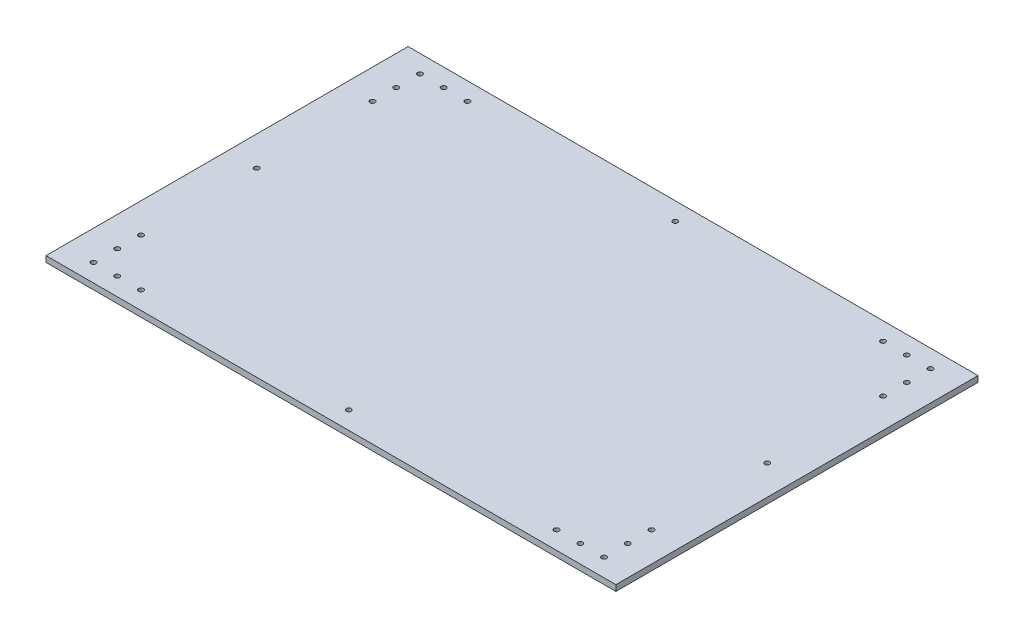
ISO-10303-21;
HEADER;
FILE_DESCRIPTION(('STEP AP214'),'2;1');
FILE_NAME('part.step','',(''),(''),'','','');
FILE_SCHEMA(('AUTOMOTIVE_DESIGN { 1 0 10303 214 1 1 1 1 }'));
ENDSEC;
DATA;
#1=APPLICATION_CONTEXT('core data for automotive mechanical design processes');
#2=APPLICATION_PROTOCOL_DEFINITION('international standard','automotive_design',2000,#1);
#3=PRODUCT_CONTEXT('',#1,'mechanical');
#4=PRODUCT('Part','Part','',(#3));
#5=PRODUCT_RELATED_PRODUCT_CATEGORY('part','',(#4));
#6=PRODUCT_DEFINITION_FORMATION('','',#4);
#7=PRODUCT_DEFINITION_CONTEXT('part definition',#1,'design');
#8=PRODUCT_DEFINITION('design','',#6,#7);
#9=PRODUCT_DEFINITION_SHAPE('','',#8);
#10=(LENGTH_UNIT() NAMED_UNIT(*) SI_UNIT(.MILLI.,.METRE.));
#11=(NAMED_UNIT(*) PLANE_ANGLE_UNIT() SI_UNIT($,.RADIAN.));
#12=(NAMED_UNIT(*) SI_UNIT($,.STERADIAN.) SOLID_ANGLE_UNIT());
#13=UNCERTAINTY_MEASURE_WITH_UNIT(LENGTH_MEASURE(1.E-05),#10,'distance_accuracy_value','');
#14=(GEOMETRIC_REPRESENTATION_CONTEXT(3) GLOBAL_UNCERTAINTY_ASSIGNED_CONTEXT((#13)) GLOBAL_UNIT_ASSIGNED_CONTEXT((#10,
#11,#12)) REPRESENTATION_CONTEXT('',''));
#15=CARTESIAN_POINT('',(0.,0.,0.));
#16=DIRECTION('',(0.,0.,1.));
#17=DIRECTION('',(1.,0.,0.));
#18=AXIS2_PLACEMENT_3D('',#15,#16,#17);
#19=CARTESIAN_POINT('',(0.,6.35,0.));
#20=DIRECTION('',(0.,-1.,0.));
#21=DIRECTION('',(0.,0.,-1.));
#22=AXIS2_PLACEMENT_3D('',#19,#20,#21);
#23=PLANE('',#22);
#24=CARTESIAN_POINT('',(31.7499999999999,6.35,-368.3));
#25=DIRECTION('',(0.,1.,0.));
#26=DIRECTION('',(0.,0.,1.));
#27=AXIS2_PLACEMENT_3D('',#24,#25,#26);
#28=CIRCLE('',#27,2.64999999999999);
#29=CARTESIAN_POINT('',(31.7499999999999,6.35,-365.65));
#30=VERTEX_POINT('',#29);
#31=EDGE_CURVE('E251',#30,#30,#28,.T.);
#32=ORIENTED_EDGE('',*,*,#31,.F.);
#33=EDGE_LOOP('',(#32));
#34=FACE_BOUND('',#33,.T.);
#35=CARTESIAN_POINT('',(57.1499999999999,6.35,-368.3));
#36=DIRECTION('',(0.,1.,0.));
#37=DIRECTION('',(0.,0.,1.));
#38=AXIS2_PLACEMENT_3D('',#35,#36,#37);
#39=CIRCLE('',#38,2.64999999999999);
#40=CARTESIAN_POINT('',(57.1499999999999,6.35,-365.65));
#41=VERTEX_POINT('',#40);
#42=EDGE_CURVE('E245',#41,#41,#39,.T.);
#43=ORIENTED_EDGE('',*,*,#42,.F.);
#44=EDGE_LOOP('',(#43));
#45=FACE_BOUND('',#44,.T.);
#46=CARTESIAN_POINT('',(82.55,6.35,-368.3));
#47=DIRECTION('',(0.,1.,0.));
#48=DIRECTION('',(0.,0.,1.));
#49=AXIS2_PLACEMENT_3D('',#46,#47,#48);
#50=CIRCLE('',#49,2.64999999999999);
#51=CARTESIAN_POINT('',(82.55,6.35,-365.65));
#52=VERTEX_POINT('',#51);
#53=EDGE_CURVE('E239',#52,#52,#50,.T.);
#54=ORIENTED_EDGE('',*,*,#53,.F.);
#55=EDGE_LOOP('',(#54));
#56=FACE_BOUND('',#55,.T.);
#57=CARTESIAN_POINT('',(31.75,6.35,-342.9));
#58=DIRECTION('',(0.,1.,0.));
#59=DIRECTION('',(0.,0.,1.));
#60=AXIS2_PLACEMENT_3D('',#57,#58,#59);
#61=CIRCLE('',#60,2.64999999999999);
#62=CARTESIAN_POINT('',(31.75,6.35,-340.25));
#63=VERTEX_POINT('',#62);
#64=EDGE_CURVE('E233',#63,#63,#61,.T.);
#65=ORIENTED_EDGE('',*,*,#64,.F.);
#66=EDGE_LOOP('',(#65));
#67=FACE_BOUND('',#66,.T.);
#68=CARTESIAN_POINT('',(31.75,6.35,-317.5));
#69=DIRECTION('',(0.,1.,0.));
#70=DIRECTION('',(0.,0.,1.));
#71=AXIS2_PLACEMENT_3D('',#68,#69,#70);
#72=CIRCLE('',#71,2.64999999999999);
#73=CARTESIAN_POINT('',(31.75,6.35,-314.85));
#74=VERTEX_POINT('',#73);
#75=EDGE_CURVE('E227',#74,#74,#72,.T.);
#76=ORIENTED_EDGE('',*,*,#75,.F.);
#77=EDGE_LOOP('',(#76));
#78=FACE_BOUND('',#77,.T.);
#79=CARTESIAN_POINT('',(31.75,6.35,-69.8500000000001));
#80=DIRECTION('',(0.,1.,0.));
#81=DIRECTION('',(0.,0.,1.));
#82=AXIS2_PLACEMENT_3D('',#79,#80,#81);
#83=CIRCLE('',#82,2.64999999999999);
#84=CARTESIAN_POINT('',(31.75,6.35,-67.2000000000001));
#85=VERTEX_POINT('',#84);
#86=EDGE_CURVE('E221',#85,#85,#83,.T.);
#87=ORIENTED_EDGE('',*,*,#86,.F.);
#88=EDGE_LOOP('',(#87));
#89=FACE_BOUND('',#88,.T.);
#90=CARTESIAN_POINT('',(31.75,6.35,-44.4500000000001));
#91=DIRECTION('',(0.,1.,0.));
#92=DIRECTION('',(0.,0.,1.));
#93=AXIS2_PLACEMENT_3D('',#90,#91,#92);
#94=CIRCLE('',#93,2.64999999999999);
#95=CARTESIAN_POINT('',(31.75,6.35,-41.8000000000001));
#96=VERTEX_POINT('',#95);
#97=EDGE_CURVE('E215',#96,#96,#94,.T.);
#98=ORIENTED_EDGE('',*,*,#97,.F.);
#99=EDGE_LOOP('',(#98));
#100=FACE_BOUND('',#99,.T.);
#101=CARTESIAN_POINT('',(31.75,6.35,-19.05));
#102=DIRECTION('',(0.,1.,0.));
#103=DIRECTION('',(0.,0.,1.));
#104=AXIS2_PLACEMENT_3D('',#101,#102,#103);
#105=CIRCLE('',#104,2.64999999999999);
#106=CARTESIAN_POINT('',(31.75,6.35,-16.4));
#107=VERTEX_POINT('',#106);
#108=EDGE_CURVE('E209',#107,#107,#105,.T.);
#109=ORIENTED_EDGE('',*,*,#108,.F.);
#110=EDGE_LOOP('',(#109));
#111=FACE_BOUND('',#110,.T.);
#112=CARTESIAN_POINT('',(57.1499999999999,6.35,-19.05));
#113=DIRECTION('',(0.,1.,0.));
#114=DIRECTION('',(0.,0.,1.));
#115=AXIS2_PLACEMENT_3D('',#112,#113,#114);
#116=CIRCLE('',#115,2.64999999999999);
#117=CARTESIAN_POINT('',(57.1499999999999,6.35,-16.4));
#118=VERTEX_POINT('',#117);
#119=EDGE_CURVE('E203',#118,#118,#116,.T.);
#120=ORIENTED_EDGE('',*,*,#119,.F.);
#121=EDGE_LOOP('',(#120));
#122=FACE_BOUND('',#121,.T.);
#123=CARTESIAN_POINT('',(82.55,6.35,-19.05));
#124=DIRECTION('',(0.,1.,0.));
#125=DIRECTION('',(0.,0.,1.));
#126=AXIS2_PLACEMENT_3D('',#123,#124,#125);
#127=CIRCLE('',#126,2.64999999999999);
#128=CARTESIAN_POINT('',(82.55,6.35,-16.4));
#129=VERTEX_POINT('',#128);
#130=EDGE_CURVE('E197',#129,#129,#127,.T.);
#131=ORIENTED_EDGE('',*,*,#130,.F.);
#132=EDGE_LOOP('',(#131));
#133=FACE_BOUND('',#132,.T.);
#134=CARTESIAN_POINT('',(304.8,6.35,-19.05));
#135=DIRECTION('',(0.,1.,0.));
#136=DIRECTION('',(0.,0.,1.));
#137=AXIS2_PLACEMENT_3D('',#134,#135,#136);
#138=CIRCLE('',#137,2.64999999999999);
#139=CARTESIAN_POINT('',(304.8,6.35,-16.4));
#140=VERTEX_POINT('',#139);
#141=EDGE_CURVE('E191',#140,#140,#138,.T.);
#142=ORIENTED_EDGE('',*,*,#141,.F.);
#143=EDGE_LOOP('',(#142));
#144=FACE_BOUND('',#143,.T.);
#145=CARTESIAN_POINT('',(31.75,6.35,-193.675));
#146=DIRECTION('',(0.,1.,0.));
#147=DIRECTION('',(0.,0.,1.));
#148=AXIS2_PLACEMENT_3D('',#145,#146,#147);
#149=CIRCLE('',#148,2.64999999999999);
#150=CARTESIAN_POINT('',(31.75,6.35,-191.025));
#151=VERTEX_POINT('',#150);
#152=EDGE_CURVE('E185',#151,#151,#149,.T.);
#153=ORIENTED_EDGE('',*,*,#152,.F.);
#154=EDGE_LOOP('',(#153));
#155=FACE_BOUND('',#154,.T.);
#156=CARTESIAN_POINT('',(304.8,6.35,-368.3));
#157=DIRECTION('',(0.,1.,0.));
#158=DIRECTION('',(0.,0.,1.));
#159=AXIS2_PLACEMENT_3D('',#156,#157,#158);
#160=CIRCLE('',#159,2.64999999999999);
#161=CARTESIAN_POINT('',(304.8,6.35,-365.65));
#162=VERTEX_POINT('',#161);
#163=EDGE_CURVE('E179',#162,#162,#160,.T.);
#164=ORIENTED_EDGE('',*,*,#163,.F.);
#165=EDGE_LOOP('',(#164));
#166=FACE_BOUND('',#165,.T.);
#167=CARTESIAN_POINT('',(577.85,6.35,-193.675));
#168=DIRECTION('',(0.,1.,0.));
#169=DIRECTION('',(0.,0.,1.));
#170=AXIS2_PLACEMENT_3D('',#167,#168,#169);
#171=CIRCLE('',#170,2.65000000000004);
#172=CARTESIAN_POINT('',(577.85,6.35,-191.025));
#173=VERTEX_POINT('',#172);
#174=EDGE_CURVE('E173',#173,#173,#171,.T.);
#175=ORIENTED_EDGE('',*,*,#174,.F.);
#176=EDGE_LOOP('',(#175));
#177=FACE_BOUND('',#176,.T.);
#178=CARTESIAN_POINT('',(527.05,6.35,-368.3));
#179=DIRECTION('',(0.,1.,0.));
#180=DIRECTION('',(0.,0.,1.));
#181=AXIS2_PLACEMENT_3D('',#178,#179,#180);
#182=CIRCLE('',#181,2.65000000000004);
#183=CARTESIAN_POINT('',(527.05,6.35,-365.65));
#184=VERTEX_POINT('',#183);
#185=EDGE_CURVE('E167',#184,#184,#182,.T.);
#186=ORIENTED_EDGE('',*,*,#185,.F.);
#187=EDGE_LOOP('',(#186));
#188=FACE_BOUND('',#187,.T.);
#189=CARTESIAN_POINT('',(552.45,6.35,-368.3));
#190=DIRECTION('',(0.,1.,0.));
#191=DIRECTION('',(0.,0.,1.));
#192=AXIS2_PLACEMENT_3D('',#189,#190,#191);
#193=CIRCLE('',#192,2.65000000000004);
#194=CARTESIAN_POINT('',(552.45,6.35,-365.65));
#195=VERTEX_POINT('',#194);
#196=EDGE_CURVE('E161',#195,#195,#193,.T.);
#197=ORIENTED_EDGE('',*,*,#196,.F.);
#198=EDGE_LOOP('',(#197));
#199=FACE_BOUND('',#198,.T.);
#200=CARTESIAN_POINT('',(577.85,6.35,-368.3));
#201=DIRECTION('',(0.,1.,0.));
#202=DIRECTION('',(0.,0.,1.));
#203=AXIS2_PLACEMENT_3D('',#200,#201,#202);
#204=CIRCLE('',#203,2.65000000000004);
#205=CARTESIAN_POINT('',(577.85,6.35,-365.65));
#206=VERTEX_POINT('',#205);
#207=EDGE_CURVE('E155',#206,#206,#204,.T.);
#208=ORIENTED_EDGE('',*,*,#207,.F.);
#209=EDGE_LOOP('',(#208));
#210=FACE_BOUND('',#209,.T.);
#211=CARTESIAN_POINT('',(577.85,6.35,-342.9));
#212=DIRECTION('',(0.,1.,0.));
#213=DIRECTION('',(0.,0.,1.));
#214=AXIS2_PLACEMENT_3D('',#211,#212,#213);
#215=CIRCLE('',#214,2.65000000000004);
#216=CARTESIAN_POINT('',(577.85,6.35,-340.25));
#217=VERTEX_POINT('',#216);
#218=EDGE_CURVE('E149',#217,#217,#215,.T.);
#219=ORIENTED_EDGE('',*,*,#218,.F.);
#220=EDGE_LOOP('',(#219));
#221=FACE_BOUND('',#220,.T.);
#222=CARTESIAN_POINT('',(577.85,6.35,-317.5));
#223=DIRECTION('',(0.,1.,0.));
#224=DIRECTION('',(0.,0.,1.));
#225=AXIS2_PLACEMENT_3D('',#222,#223,#224);
#226=CIRCLE('',#225,2.65000000000004);
#227=CARTESIAN_POINT('',(577.85,6.35,-314.85));
#228=VERTEX_POINT('',#227);
#229=EDGE_CURVE('E143',#228,#228,#226,.T.);
#230=ORIENTED_EDGE('',*,*,#229,.F.);
#231=EDGE_LOOP('',(#230));
#232=FACE_BOUND('',#231,.T.);
#233=CARTESIAN_POINT('',(577.85,6.35,-69.85));
#234=DIRECTION('',(0.,1.,0.));
#235=DIRECTION('',(0.,0.,1.));
#236=AXIS2_PLACEMENT_3D('',#233,#234,#235);
#237=CIRCLE('',#236,2.65000000000004);
#238=CARTESIAN_POINT('',(577.85,6.35,-67.2));
#239=VERTEX_POINT('',#238);
#240=EDGE_CURVE('E137',#239,#239,#237,.T.);
#241=ORIENTED_EDGE('',*,*,#240,.F.);
#242=EDGE_LOOP('',(#241));
#243=FACE_BOUND('',#242,.T.);
#244=CARTESIAN_POINT('',(577.85,6.35,-44.45));
#245=DIRECTION('',(0.,1.,0.));
#246=DIRECTION('',(0.,0.,1.));
#247=AXIS2_PLACEMENT_3D('',#244,#245,#246);
#248=CIRCLE('',#247,2.65000000000004);
#249=CARTESIAN_POINT('',(577.85,6.35,-41.8));
#250=VERTEX_POINT('',#249);
#251=EDGE_CURVE('E131',#250,#250,#248,.T.);
#252=ORIENTED_EDGE('',*,*,#251,.F.);
#253=EDGE_LOOP('',(#252));
#254=FACE_BOUND('',#253,.T.);
#255=CARTESIAN_POINT('',(577.85,6.35,-19.0500000000001));
#256=DIRECTION('',(0.,1.,0.));
#257=DIRECTION('',(0.,0.,1.));
#258=AXIS2_PLACEMENT_3D('',#255,#256,#257);
#259=CIRCLE('',#258,2.65000000000004);
#260=CARTESIAN_POINT('',(577.85,6.35,-16.4));
#261=VERTEX_POINT('',#260);
#262=EDGE_CURVE('E125',#261,#261,#259,.T.);
#263=ORIENTED_EDGE('',*,*,#262,.F.);
#264=EDGE_LOOP('',(#263));
#265=FACE_BOUND('',#264,.T.);
#266=CARTESIAN_POINT('',(552.45,6.35,-19.05));
#267=DIRECTION('',(0.,1.,0.));
#268=DIRECTION('',(0.,0.,1.));
#269=AXIS2_PLACEMENT_3D('',#266,#267,#268);
#270=CIRCLE('',#269,2.65000000000004);
#271=CARTESIAN_POINT('',(552.45,6.35,-16.3999999999999));
#272=VERTEX_POINT('',#271);
#273=EDGE_CURVE('E119',#272,#272,#270,.T.);
#274=ORIENTED_EDGE('',*,*,#273,.F.);
#275=EDGE_LOOP('',(#274));
#276=FACE_BOUND('',#275,.T.);
#277=CARTESIAN_POINT('',(527.05,6.35,-19.05));
#278=DIRECTION('',(0.,1.,0.));
#279=DIRECTION('',(0.,0.,1.));
#280=AXIS2_PLACEMENT_3D('',#277,#278,#279);
#281=CIRCLE('',#280,2.65000000000004);
#282=CARTESIAN_POINT('',(527.05,6.35,-16.3999999999999));
#283=VERTEX_POINT('',#282);
#284=EDGE_CURVE('E113',#283,#283,#281,.T.);
#285=ORIENTED_EDGE('',*,*,#284,.F.);
#286=EDGE_LOOP('',(#285));
#287=FACE_BOUND('',#286,.T.);
#288=DIRECTION('',(1.,0.,0.));
#289=VECTOR('',#288,1.);
#290=CARTESIAN_POINT('',(0.,6.35,-387.35));
#291=LINE('',#290,#289);
#292=CARTESIAN_POINT('',(0.,6.35,-387.35));
#293=VERTEX_POINT('',#292);
#294=CARTESIAN_POINT('',(609.6,6.35,-387.35));
#295=VERTEX_POINT('',#294);
#296=EDGE_CURVE('E106',#293,#295,#291,.T.);
#297=ORIENTED_EDGE('',*,*,#296,.F.);
#298=DIRECTION('',(0.,0.,1.));
#299=VECTOR('',#298,1.);
#300=CARTESIAN_POINT('',(0.,6.35,0.));
#301=LINE('',#300,#299);
#302=CARTESIAN_POINT('',(0.,6.35,0.));
#303=VERTEX_POINT('',#302);
#304=EDGE_CURVE('E101',#293,#303,#301,.T.);
#305=ORIENTED_EDGE('',*,*,#304,.T.);
#306=DIRECTION('',(1.,0.,0.));
#307=VECTOR('',#306,1.);
#308=CARTESIAN_POINT('',(0.,6.35,0.));
#309=LINE('',#308,#307);
#310=CARTESIAN_POINT('',(609.6,6.35,0.));
#311=VERTEX_POINT('',#310);
#312=EDGE_CURVE('E71',#303,#311,#309,.T.);
#313=ORIENTED_EDGE('',*,*,#312,.T.);
#314=DIRECTION('',(0.,0.,-1.));
#315=VECTOR('',#314,1.);
#316=CARTESIAN_POINT('',(609.6,6.35,0.));
#317=LINE('',#316,#315);
#318=EDGE_CURVE('E97',#311,#295,#317,.T.);
#319=ORIENTED_EDGE('',*,*,#318,.T.);
#320=EDGE_LOOP('',(#297,#305,#313,#319));
#321=FACE_BOUND('',#320,.T.);
#322=ADVANCED_FACE('F47',(#34,#45,#56,#67,#78,#89,#100,#111,#122,#133,#144,#155,#166,#177,#188,
#199,#210,#221,#232,#243,#254,#265,#276,#287,#321),#23,.F.);
#323=CARTESIAN_POINT('',(0.,6.35,0.));
#324=DIRECTION('',(1.,0.,0.));
#325=DIRECTION('',(0.,0.,-1.));
#326=AXIS2_PLACEMENT_3D('',#323,#324,#325);
#327=PLANE('',#326);
#328=ORIENTED_EDGE('',*,*,#304,.F.);
#329=DIRECTION('',(0.,1.,0.));
#330=VECTOR('',#329,1.);
#331=CARTESIAN_POINT('',(0.,-0.001000000000001,-387.35));
#332=LINE('',#331,#330);
#333=CARTESIAN_POINT('',(0.,0.,-387.35));
#334=VERTEX_POINT('',#333);
#335=EDGE_CURVE('E255',#334,#293,#332,.T.);
#336=ORIENTED_EDGE('',*,*,#335,.F.);
#337=DIRECTION('',(0.,0.,1.));
#338=VECTOR('',#337,1.);
#339=CARTESIAN_POINT('',(0.,0.,0.));
#340=LINE('',#339,#338);
#341=CARTESIAN_POINT('',(0.,0.,0.));
#342=VERTEX_POINT('',#341);
#343=EDGE_CURVE('E92',#334,#342,#340,.T.);
#344=ORIENTED_EDGE('',*,*,#343,.T.);
#345=DIRECTION('',(0.,-1.,0.));
#346=VECTOR('',#345,1.);
#347=CARTESIAN_POINT('',(0.,6.35,0.));
#348=LINE('',#347,#346);
#349=EDGE_CURVE('E11',#303,#342,#348,.T.);
#350=ORIENTED_EDGE('',*,*,#349,.F.);
#351=EDGE_LOOP('',(#328,#336,#344,#350));
#352=FACE_BOUND('',#351,.T.);
#353=ADVANCED_FACE('F49',(#352),#327,.F.);
#354=CARTESIAN_POINT('',(0.,6.35,0.));
#355=DIRECTION('',(0.,0.,-1.));
#356=DIRECTION('',(-1.,0.,0.));
#357=AXIS2_PLACEMENT_3D('',#354,#355,#356);
#358=PLANE('',#357);
#359=DIRECTION('',(1.,0.,0.));
#360=VECTOR('',#359,1.);
#361=CARTESIAN_POINT('',(0.,0.,0.));
#362=LINE('',#361,#360);
#363=CARTESIAN_POINT('',(609.6,0.,0.));
#364=VERTEX_POINT('',#363);
#365=EDGE_CURVE('E83',#342,#364,#362,.T.);
#366=ORIENTED_EDGE('',*,*,#365,.T.);
#367=DIRECTION('',(0.,-1.,0.));
#368=VECTOR('',#367,1.);
#369=CARTESIAN_POINT('',(609.6,6.35,0.));
#370=LINE('',#369,#368);
#371=EDGE_CURVE('E55',#311,#364,#370,.T.);
#372=ORIENTED_EDGE('',*,*,#371,.F.);
#373=ORIENTED_EDGE('',*,*,#312,.F.);
#374=ORIENTED_EDGE('',*,*,#349,.T.);
#375=EDGE_LOOP('',(#366,#372,#373,#374));
#376=FACE_BOUND('',#375,.T.);
#377=ADVANCED_FACE('F85',(#376),#358,.F.);
#378=CARTESIAN_POINT('',(609.6,6.35,0.));
#379=DIRECTION('',(-1.,0.,0.));
#380=DIRECTION('',(0.,0.,1.));
#381=AXIS2_PLACEMENT_3D('',#378,#379,#380);
#382=PLANE('',#381);
#383=DIRECTION('',(0.,0.,-1.));
#384=VECTOR('',#383,1.);
#385=CARTESIAN_POINT('',(609.6,0.,0.));
#386=LINE('',#385,#384);
#387=CARTESIAN_POINT('',(609.6,0.,-387.35));
#388=VERTEX_POINT('',#387);
#389=EDGE_CURVE('E91',#364,#388,#386,.T.);
#390=ORIENTED_EDGE('',*,*,#389,.T.);
#391=DIRECTION('',(0.,1.,0.));
#392=VECTOR('',#391,1.);
#393=CARTESIAN_POINT('',(609.6,-0.001000000000001,-387.35));
#394=LINE('',#393,#392);
#395=EDGE_CURVE('E62',#388,#295,#394,.T.);
#396=ORIENTED_EDGE('',*,*,#395,.T.);
#397=ORIENTED_EDGE('',*,*,#318,.F.);
#398=ORIENTED_EDGE('',*,*,#371,.T.);
#399=EDGE_LOOP('',(#390,#396,#397,#398));
#400=FACE_BOUND('',#399,.T.);
#401=ADVANCED_FACE('F96',(#400),#382,.F.);
#402=CARTESIAN_POINT('',(0.,0.,0.));
#403=DIRECTION('',(0.,-1.,0.));
#404=DIRECTION('',(0.,0.,-1.));
#405=AXIS2_PLACEMENT_3D('',#402,#403,#404);
#406=PLANE('',#405);
#407=DIRECTION('',(1.,0.,0.));
#408=VECTOR('',#407,1.);
#409=CARTESIAN_POINT('',(0.,0.,-387.35));
#410=LINE('',#409,#408);
#411=EDGE_CURVE('E100',#334,#388,#410,.T.);
#412=ORIENTED_EDGE('',*,*,#411,.T.);
#413=ORIENTED_EDGE('',*,*,#389,.F.);
#414=ORIENTED_EDGE('',*,*,#365,.F.);
#415=ORIENTED_EDGE('',*,*,#343,.F.);
#416=EDGE_LOOP('',(#412,#413,#414,#415));
#417=FACE_BOUND('',#416,.T.);
#418=CARTESIAN_POINT('',(31.7499999999999,0.,-368.3));
#419=DIRECTION('',(0.,1.,0.));
#420=DIRECTION('',(0.,0.,1.));
#421=AXIS2_PLACEMENT_3D('',#418,#419,#420);
#422=CIRCLE('',#421,2.65);
#423=CARTESIAN_POINT('',(31.7499999999999,0.,-365.65));
#424=VERTEX_POINT('',#423);
#425=EDGE_CURVE('E248',#424,#424,#422,.T.);
#426=ORIENTED_EDGE('',*,*,#425,.T.);
#427=EDGE_LOOP('',(#426));
#428=FACE_BOUND('',#427,.T.);
#429=CARTESIAN_POINT('',(57.1499999999999,0.,-368.3));
#430=DIRECTION('',(0.,1.,0.));
#431=DIRECTION('',(0.,0.,1.));
#432=AXIS2_PLACEMENT_3D('',#429,#430,#431);
#433=CIRCLE('',#432,2.65);
#434=CARTESIAN_POINT('',(57.1499999999999,0.,-365.65));
#435=VERTEX_POINT('',#434);
#436=EDGE_CURVE('E242',#435,#435,#433,.T.);
#437=ORIENTED_EDGE('',*,*,#436,.T.);
#438=EDGE_LOOP('',(#437));
#439=FACE_BOUND('',#438,.T.);
#440=CARTESIAN_POINT('',(82.55,0.,-368.3));
#441=DIRECTION('',(0.,1.,0.));
#442=DIRECTION('',(0.,0.,1.));
#443=AXIS2_PLACEMENT_3D('',#440,#441,#442);
#444=CIRCLE('',#443,2.65);
#445=CARTESIAN_POINT('',(82.55,0.,-365.65));
#446=VERTEX_POINT('',#445);
#447=EDGE_CURVE('E236',#446,#446,#444,.T.);
#448=ORIENTED_EDGE('',*,*,#447,.T.);
#449=EDGE_LOOP('',(#448));
#450=FACE_BOUND('',#449,.T.);
#451=CARTESIAN_POINT('',(31.75,0.,-342.9));
#452=DIRECTION('',(0.,1.,0.));
#453=DIRECTION('',(0.,0.,1.));
#454=AXIS2_PLACEMENT_3D('',#451,#452,#453);
#455=CIRCLE('',#454,2.65);
#456=CARTESIAN_POINT('',(31.75,0.,-340.25));
#457=VERTEX_POINT('',#456);
#458=EDGE_CURVE('E230',#457,#457,#455,.T.);
#459=ORIENTED_EDGE('',*,*,#458,.T.);
#460=EDGE_LOOP('',(#459));
#461=FACE_BOUND('',#460,.T.);
#462=CARTESIAN_POINT('',(31.75,0.,-317.5));
#463=DIRECTION('',(0.,1.,0.));
#464=DIRECTION('',(0.,0.,1.));
#465=AXIS2_PLACEMENT_3D('',#462,#463,#464);
#466=CIRCLE('',#465,2.65);
#467=CARTESIAN_POINT('',(31.75,0.,-314.85));
#468=VERTEX_POINT('',#467);
#469=EDGE_CURVE('E224',#468,#468,#466,.T.);
#470=ORIENTED_EDGE('',*,*,#469,.T.);
#471=EDGE_LOOP('',(#470));
#472=FACE_BOUND('',#471,.T.);
#473=CARTESIAN_POINT('',(31.75,0.,-69.8500000000001));
#474=DIRECTION('',(0.,1.,0.));
#475=DIRECTION('',(0.,0.,1.));
#476=AXIS2_PLACEMENT_3D('',#473,#474,#475);
#477=CIRCLE('',#476,2.65);
#478=CARTESIAN_POINT('',(31.75,0.,-67.2000000000001));
#479=VERTEX_POINT('',#478);
#480=EDGE_CURVE('E218',#479,#479,#477,.T.);
#481=ORIENTED_EDGE('',*,*,#480,.T.);
#482=EDGE_LOOP('',(#481));
#483=FACE_BOUND('',#482,.T.);
#484=CARTESIAN_POINT('',(31.75,0.,-44.4500000000001));
#485=DIRECTION('',(0.,1.,0.));
#486=DIRECTION('',(0.,0.,1.));
#487=AXIS2_PLACEMENT_3D('',#484,#485,#486);
#488=CIRCLE('',#487,2.65);
#489=CARTESIAN_POINT('',(31.75,0.,-41.8000000000001));
#490=VERTEX_POINT('',#489);
#491=EDGE_CURVE('E212',#490,#490,#488,.T.);
#492=ORIENTED_EDGE('',*,*,#491,.T.);
#493=EDGE_LOOP('',(#492));
#494=FACE_BOUND('',#493,.T.);
#495=CARTESIAN_POINT('',(31.75,0.,-19.05));
#496=DIRECTION('',(0.,1.,0.));
#497=DIRECTION('',(0.,0.,1.));
#498=AXIS2_PLACEMENT_3D('',#495,#496,#497);
#499=CIRCLE('',#498,2.65);
#500=CARTESIAN_POINT('',(31.75,0.,-16.4));
#501=VERTEX_POINT('',#500);
#502=EDGE_CURVE('E206',#501,#501,#499,.T.);
#503=ORIENTED_EDGE('',*,*,#502,.T.);
#504=EDGE_LOOP('',(#503));
#505=FACE_BOUND('',#504,.T.);
#506=CARTESIAN_POINT('',(57.1499999999999,0.,-19.05));
#507=DIRECTION('',(0.,1.,0.));
#508=DIRECTION('',(0.,0.,1.));
#509=AXIS2_PLACEMENT_3D('',#506,#507,#508);
#510=CIRCLE('',#509,2.65);
#511=CARTESIAN_POINT('',(57.1499999999999,0.,-16.4));
#512=VERTEX_POINT('',#511);
#513=EDGE_CURVE('E200',#512,#512,#510,.T.);
#514=ORIENTED_EDGE('',*,*,#513,.T.);
#515=EDGE_LOOP('',(#514));
#516=FACE_BOUND('',#515,.T.);
#517=CARTESIAN_POINT('',(82.55,0.,-19.05));
#518=DIRECTION('',(0.,1.,0.));
#519=DIRECTION('',(0.,0.,1.));
#520=AXIS2_PLACEMENT_3D('',#517,#518,#519);
#521=CIRCLE('',#520,2.65);
#522=CARTESIAN_POINT('',(82.55,0.,-16.4));
#523=VERTEX_POINT('',#522);
#524=EDGE_CURVE('E194',#523,#523,#521,.T.);
#525=ORIENTED_EDGE('',*,*,#524,.T.);
#526=EDGE_LOOP('',(#525));
#527=FACE_BOUND('',#526,.T.);
#528=CARTESIAN_POINT('',(304.8,0.,-19.05));
#529=DIRECTION('',(0.,1.,0.));
#530=DIRECTION('',(0.,0.,1.));
#531=AXIS2_PLACEMENT_3D('',#528,#529,#530);
#532=CIRCLE('',#531,2.64999999999999);
#533=CARTESIAN_POINT('',(304.8,0.,-16.4));
#534=VERTEX_POINT('',#533);
#535=EDGE_CURVE('E188',#534,#534,#532,.T.);
#536=ORIENTED_EDGE('',*,*,#535,.T.);
#537=EDGE_LOOP('',(#536));
#538=FACE_BOUND('',#537,.T.);
#539=CARTESIAN_POINT('',(31.75,0.,-193.675));
#540=DIRECTION('',(0.,1.,0.));
#541=DIRECTION('',(0.,0.,1.));
#542=AXIS2_PLACEMENT_3D('',#539,#540,#541);
#543=CIRCLE('',#542,2.65);
#544=CARTESIAN_POINT('',(31.75,0.,-191.025));
#545=VERTEX_POINT('',#544);
#546=EDGE_CURVE('E182',#545,#545,#543,.T.);
#547=ORIENTED_EDGE('',*,*,#546,.T.);
#548=EDGE_LOOP('',(#547));
#549=FACE_BOUND('',#548,.T.);
#550=CARTESIAN_POINT('',(304.8,0.,-368.3));
#551=DIRECTION('',(0.,1.,0.));
#552=DIRECTION('',(0.,0.,1.));
#553=AXIS2_PLACEMENT_3D('',#550,#551,#552);
#554=CIRCLE('',#553,2.64999999999999);
#555=CARTESIAN_POINT('',(304.8,0.,-365.65));
#556=VERTEX_POINT('',#555);
#557=EDGE_CURVE('E176',#556,#556,#554,.T.);
#558=ORIENTED_EDGE('',*,*,#557,.T.);
#559=EDGE_LOOP('',(#558));
#560=FACE_BOUND('',#559,.T.);
#561=CARTESIAN_POINT('',(577.85,0.,-193.675));
#562=DIRECTION('',(0.,1.,0.));
#563=DIRECTION('',(0.,0.,1.));
#564=AXIS2_PLACEMENT_3D('',#561,#562,#563);
#565=CIRCLE('',#564,2.65000000000004);
#566=CARTESIAN_POINT('',(577.85,0.,-191.025));
#567=VERTEX_POINT('',#566);
#568=EDGE_CURVE('E170',#567,#567,#565,.T.);
#569=ORIENTED_EDGE('',*,*,#568,.T.);
#570=EDGE_LOOP('',(#569));
#571=FACE_BOUND('',#570,.T.);
#572=CARTESIAN_POINT('',(527.05,0.,-368.3));
#573=DIRECTION('',(0.,1.,0.));
#574=DIRECTION('',(0.,0.,1.));
#575=AXIS2_PLACEMENT_3D('',#572,#573,#574);
#576=CIRCLE('',#575,2.65000000000004);
#577=CARTESIAN_POINT('',(527.05,0.,-365.65));
#578=VERTEX_POINT('',#577);
#579=EDGE_CURVE('E164',#578,#578,#576,.T.);
#580=ORIENTED_EDGE('',*,*,#579,.T.);
#581=EDGE_LOOP('',(#580));
#582=FACE_BOUND('',#581,.T.);
#583=CARTESIAN_POINT('',(552.45,0.,-368.3));
#584=DIRECTION('',(0.,1.,0.));
#585=DIRECTION('',(0.,0.,1.));
#586=AXIS2_PLACEMENT_3D('',#583,#584,#585);
#587=CIRCLE('',#586,2.65000000000004);
#588=CARTESIAN_POINT('',(552.45,0.,-365.65));
#589=VERTEX_POINT('',#588);
#590=EDGE_CURVE('E158',#589,#589,#587,.T.);
#591=ORIENTED_EDGE('',*,*,#590,.T.);
#592=EDGE_LOOP('',(#591));
#593=FACE_BOUND('',#592,.T.);
#594=CARTESIAN_POINT('',(577.85,0.,-368.3));
#595=DIRECTION('',(0.,1.,0.));
#596=DIRECTION('',(0.,0.,1.));
#597=AXIS2_PLACEMENT_3D('',#594,#595,#596);
#598=CIRCLE('',#597,2.65000000000004);
#599=CARTESIAN_POINT('',(577.85,0.,-365.65));
#600=VERTEX_POINT('',#599);
#601=EDGE_CURVE('E152',#600,#600,#598,.T.);
#602=ORIENTED_EDGE('',*,*,#601,.T.);
#603=EDGE_LOOP('',(#602));
#604=FACE_BOUND('',#603,.T.);
#605=CARTESIAN_POINT('',(577.85,0.,-342.9));
#606=DIRECTION('',(0.,1.,0.));
#607=DIRECTION('',(0.,0.,1.));
#608=AXIS2_PLACEMENT_3D('',#605,#606,#607);
#609=CIRCLE('',#608,2.65000000000004);
#610=CARTESIAN_POINT('',(577.85,0.,-340.25));
#611=VERTEX_POINT('',#610);
#612=EDGE_CURVE('E146',#611,#611,#609,.T.);
#613=ORIENTED_EDGE('',*,*,#612,.T.);
#614=EDGE_LOOP('',(#613));
#615=FACE_BOUND('',#614,.T.);
#616=CARTESIAN_POINT('',(577.85,0.,-317.5));
#617=DIRECTION('',(0.,1.,0.));
#618=DIRECTION('',(0.,0.,1.));
#619=AXIS2_PLACEMENT_3D('',#616,#617,#618);
#620=CIRCLE('',#619,2.65000000000004);
#621=CARTESIAN_POINT('',(577.85,0.,-314.85));
#622=VERTEX_POINT('',#621);
#623=EDGE_CURVE('E140',#622,#622,#620,.T.);
#624=ORIENTED_EDGE('',*,*,#623,.T.);
#625=EDGE_LOOP('',(#624));
#626=FACE_BOUND('',#625,.T.);
#627=CARTESIAN_POINT('',(577.85,0.,-69.85));
#628=DIRECTION('',(0.,1.,0.));
#629=DIRECTION('',(0.,0.,1.));
#630=AXIS2_PLACEMENT_3D('',#627,#628,#629);
#631=CIRCLE('',#630,2.65000000000004);
#632=CARTESIAN_POINT('',(577.85,0.,-67.2));
#633=VERTEX_POINT('',#632);
#634=EDGE_CURVE('E134',#633,#633,#631,.T.);
#635=ORIENTED_EDGE('',*,*,#634,.T.);
#636=EDGE_LOOP('',(#635));
#637=FACE_BOUND('',#636,.T.);
#638=CARTESIAN_POINT('',(577.85,0.,-44.45));
#639=DIRECTION('',(0.,1.,0.));
#640=DIRECTION('',(0.,0.,1.));
#641=AXIS2_PLACEMENT_3D('',#638,#639,#640);
#642=CIRCLE('',#641,2.65000000000004);
#643=CARTESIAN_POINT('',(577.85,0.,-41.8));
#644=VERTEX_POINT('',#643);
#645=EDGE_CURVE('E128',#644,#644,#642,.T.);
#646=ORIENTED_EDGE('',*,*,#645,.T.);
#647=EDGE_LOOP('',(#646));
#648=FACE_BOUND('',#647,.T.);
#649=CARTESIAN_POINT('',(577.85,0.,-19.0500000000001));
#650=DIRECTION('',(0.,1.,0.));
#651=DIRECTION('',(0.,0.,1.));
#652=AXIS2_PLACEMENT_3D('',#649,#650,#651);
#653=CIRCLE('',#652,2.65000000000004);
#654=CARTESIAN_POINT('',(577.85,0.,-16.4));
#655=VERTEX_POINT('',#654);
#656=EDGE_CURVE('E122',#655,#655,#653,.T.);
#657=ORIENTED_EDGE('',*,*,#656,.T.);
#658=EDGE_LOOP('',(#657));
#659=FACE_BOUND('',#658,.T.);
#660=CARTESIAN_POINT('',(552.45,0.,-19.05));
#661=DIRECTION('',(0.,1.,0.));
#662=DIRECTION('',(0.,0.,1.));
#663=AXIS2_PLACEMENT_3D('',#660,#661,#662);
#664=CIRCLE('',#663,2.65000000000004);
#665=CARTESIAN_POINT('',(552.45,0.,-16.3999999999999));
#666=VERTEX_POINT('',#665);
#667=EDGE_CURVE('E116',#666,#666,#664,.T.);
#668=ORIENTED_EDGE('',*,*,#667,.T.);
#669=EDGE_LOOP('',(#668));
#670=FACE_BOUND('',#669,.T.);
#671=CARTESIAN_POINT('',(527.05,0.,-19.05));
#672=DIRECTION('',(0.,1.,0.));
#673=DIRECTION('',(0.,0.,1.));
#674=AXIS2_PLACEMENT_3D('',#671,#672,#673);
#675=CIRCLE('',#674,2.65000000000004);
#676=CARTESIAN_POINT('',(527.05,0.,-16.3999999999999));
#677=VERTEX_POINT('',#676);
#678=EDGE_CURVE('E110',#677,#677,#675,.T.);
#679=ORIENTED_EDGE('',*,*,#678,.T.);
#680=EDGE_LOOP('',(#679));
#681=FACE_BOUND('',#680,.T.);
#682=ADVANCED_FACE('F98',(#417,#428,#439,#450,#461,#472,#483,#494,#505,#516,#527,#538,#549,#560,
#571,#582,#593,#604,#615,#626,#637,#648,#659,#670,#681),#406,.T.);
#683=CARTESIAN_POINT('',(527.05,6.35,-19.05));
#684=DIRECTION('',(0.,1.,0.));
#685=DIRECTION('',(0.,0.,1.));
#686=AXIS2_PLACEMENT_3D('',#683,#684,#685);
#687=CYLINDRICAL_SURFACE('',#686,2.65000000000004);
#688=ORIENTED_EDGE('',*,*,#678,.F.);
#689=EDGE_LOOP('',(#688));
#690=FACE_BOUND('',#689,.T.);
#691=ORIENTED_EDGE('',*,*,#284,.T.);
#692=EDGE_LOOP('',(#691));
#693=FACE_BOUND('',#692,.T.);
#694=ADVANCED_FACE('F287',(#690,#693),#687,.F.);
#695=CARTESIAN_POINT('',(552.45,6.35,-19.05));
#696=DIRECTION('',(0.,1.,0.));
#697=DIRECTION('',(0.,0.,1.));
#698=AXIS2_PLACEMENT_3D('',#695,#696,#697);
#699=CYLINDRICAL_SURFACE('',#698,2.65000000000004);
#700=ORIENTED_EDGE('',*,*,#667,.F.);
#701=EDGE_LOOP('',(#700));
#702=FACE_BOUND('',#701,.T.);
#703=ORIENTED_EDGE('',*,*,#273,.T.);
#704=EDGE_LOOP('',(#703));
#705=FACE_BOUND('',#704,.T.);
#706=ADVANCED_FACE('F303',(#702,#705),#699,.F.);
#707=CARTESIAN_POINT('',(577.85,6.35,-19.0500000000001));
#708=DIRECTION('',(0.,1.,0.));
#709=DIRECTION('',(0.,0.,1.));
#710=AXIS2_PLACEMENT_3D('',#707,#708,#709);
#711=CYLINDRICAL_SURFACE('',#710,2.65000000000004);
#712=ORIENTED_EDGE('',*,*,#656,.F.);
#713=EDGE_LOOP('',(#712));
#714=FACE_BOUND('',#713,.T.);
#715=ORIENTED_EDGE('',*,*,#262,.T.);
#716=EDGE_LOOP('',(#715));
#717=FACE_BOUND('',#716,.T.);
#718=ADVANCED_FACE('F312',(#714,#717),#711,.F.);
#719=CARTESIAN_POINT('',(577.85,6.35,-44.45));
#720=DIRECTION('',(0.,1.,0.));
#721=DIRECTION('',(0.,0.,1.));
#722=AXIS2_PLACEMENT_3D('',#719,#720,#721);
#723=CYLINDRICAL_SURFACE('',#722,2.65000000000004);
#724=ORIENTED_EDGE('',*,*,#645,.F.);
#725=EDGE_LOOP('',(#724));
#726=FACE_BOUND('',#725,.T.);
#727=ORIENTED_EDGE('',*,*,#251,.T.);
#728=EDGE_LOOP('',(#727));
#729=FACE_BOUND('',#728,.T.);
#730=ADVANCED_FACE('F320',(#726,#729),#723,.F.);
#731=CARTESIAN_POINT('',(577.85,6.35,-69.85));
#732=DIRECTION('',(0.,1.,0.));
#733=DIRECTION('',(0.,0.,1.));
#734=AXIS2_PLACEMENT_3D('',#731,#732,#733);
#735=CYLINDRICAL_SURFACE('',#734,2.65000000000004);
#736=ORIENTED_EDGE('',*,*,#634,.F.);
#737=EDGE_LOOP('',(#736));
#738=FACE_BOUND('',#737,.T.);
#739=ORIENTED_EDGE('',*,*,#240,.T.);
#740=EDGE_LOOP('',(#739));
#741=FACE_BOUND('',#740,.T.);
#742=ADVANCED_FACE('F329',(#738,#741),#735,.F.);
#743=CARTESIAN_POINT('',(577.85,6.35,-317.5));
#744=DIRECTION('',(0.,1.,0.));
#745=DIRECTION('',(0.,0.,1.));
#746=AXIS2_PLACEMENT_3D('',#743,#744,#745);
#747=CYLINDRICAL_SURFACE('',#746,2.65000000000004);
#748=ORIENTED_EDGE('',*,*,#623,.F.);
#749=EDGE_LOOP('',(#748));
#750=FACE_BOUND('',#749,.T.);
#751=ORIENTED_EDGE('',*,*,#229,.T.);
#752=EDGE_LOOP('',(#751));
#753=FACE_BOUND('',#752,.T.);
#754=ADVANCED_FACE('F338',(#750,#753),#747,.F.);
#755=CARTESIAN_POINT('',(577.85,6.35,-342.9));
#756=DIRECTION('',(0.,1.,0.));
#757=DIRECTION('',(0.,0.,1.));
#758=AXIS2_PLACEMENT_3D('',#755,#756,#757);
#759=CYLINDRICAL_SURFACE('',#758,2.65000000000004);
#760=ORIENTED_EDGE('',*,*,#612,.F.);
#761=EDGE_LOOP('',(#760));
#762=FACE_BOUND('',#761,.T.);
#763=ORIENTED_EDGE('',*,*,#218,.T.);
#764=EDGE_LOOP('',(#763));
#765=FACE_BOUND('',#764,.T.);
#766=ADVANCED_FACE('F347',(#762,#765),#759,.F.);
#767=CARTESIAN_POINT('',(577.85,6.35,-368.3));
#768=DIRECTION('',(0.,1.,0.));
#769=DIRECTION('',(0.,0.,1.));
#770=AXIS2_PLACEMENT_3D('',#767,#768,#769);
#771=CYLINDRICAL_SURFACE('',#770,2.65000000000004);
#772=ORIENTED_EDGE('',*,*,#601,.F.);
#773=EDGE_LOOP('',(#772));
#774=FACE_BOUND('',#773,.T.);
#775=ORIENTED_EDGE('',*,*,#207,.T.);
#776=EDGE_LOOP('',(#775));
#777=FACE_BOUND('',#776,.T.);
#778=ADVANCED_FACE('F356',(#774,#777),#771,.F.);
#779=CARTESIAN_POINT('',(552.45,6.35,-368.3));
#780=DIRECTION('',(0.,1.,0.));
#781=DIRECTION('',(0.,0.,1.));
#782=AXIS2_PLACEMENT_3D('',#779,#780,#781);
#783=CYLINDRICAL_SURFACE('',#782,2.65000000000004);
#784=ORIENTED_EDGE('',*,*,#590,.F.);
#785=EDGE_LOOP('',(#784));
#786=FACE_BOUND('',#785,.T.);
#787=ORIENTED_EDGE('',*,*,#196,.T.);
#788=EDGE_LOOP('',(#787));
#789=FACE_BOUND('',#788,.T.);
#790=ADVANCED_FACE('F365',(#786,#789),#783,.F.);
#791=CARTESIAN_POINT('',(527.05,6.35,-368.3));
#792=DIRECTION('',(0.,1.,0.));
#793=DIRECTION('',(0.,0.,1.));
#794=AXIS2_PLACEMENT_3D('',#791,#792,#793);
#795=CYLINDRICAL_SURFACE('',#794,2.65000000000004);
#796=ORIENTED_EDGE('',*,*,#579,.F.);
#797=EDGE_LOOP('',(#796));
#798=FACE_BOUND('',#797,.T.);
#799=ORIENTED_EDGE('',*,*,#185,.T.);
#800=EDGE_LOOP('',(#799));
#801=FACE_BOUND('',#800,.T.);
#802=ADVANCED_FACE('F374',(#798,#801),#795,.F.);
#803=CARTESIAN_POINT('',(577.85,6.35,-193.675));
#804=DIRECTION('',(0.,1.,0.));
#805=DIRECTION('',(0.,0.,1.));
#806=AXIS2_PLACEMENT_3D('',#803,#804,#805);
#807=CYLINDRICAL_SURFACE('',#806,2.65000000000004);
#808=ORIENTED_EDGE('',*,*,#568,.F.);
#809=EDGE_LOOP('',(#808));
#810=FACE_BOUND('',#809,.T.);
#811=ORIENTED_EDGE('',*,*,#174,.T.);
#812=EDGE_LOOP('',(#811));
#813=FACE_BOUND('',#812,.T.);
#814=ADVANCED_FACE('F383',(#810,#813),#807,.F.);
#815=CARTESIAN_POINT('',(304.8,6.35,-368.3));
#816=DIRECTION('',(0.,1.,0.));
#817=DIRECTION('',(0.,0.,1.));
#818=AXIS2_PLACEMENT_3D('',#815,#816,#817);
#819=CYLINDRICAL_SURFACE('',#818,2.64999999999999);
#820=ORIENTED_EDGE('',*,*,#557,.F.);
#821=EDGE_LOOP('',(#820));
#822=FACE_BOUND('',#821,.T.);
#823=ORIENTED_EDGE('',*,*,#163,.T.);
#824=EDGE_LOOP('',(#823));
#825=FACE_BOUND('',#824,.T.);
#826=ADVANCED_FACE('F392',(#822,#825),#819,.F.);
#827=CARTESIAN_POINT('',(31.75,6.35,-193.675));
#828=DIRECTION('',(0.,1.,0.));
#829=DIRECTION('',(0.,0.,1.));
#830=AXIS2_PLACEMENT_3D('',#827,#828,#829);
#831=CYLINDRICAL_SURFACE('',#830,2.64999999999999);
#832=ORIENTED_EDGE('',*,*,#546,.F.);
#833=EDGE_LOOP('',(#832));
#834=FACE_BOUND('',#833,.T.);
#835=ORIENTED_EDGE('',*,*,#152,.T.);
#836=EDGE_LOOP('',(#835));
#837=FACE_BOUND('',#836,.T.);
#838=ADVANCED_FACE('F401',(#834,#837),#831,.F.);
#839=CARTESIAN_POINT('',(304.8,6.35,-19.05));
#840=DIRECTION('',(0.,1.,0.));
#841=DIRECTION('',(0.,0.,1.));
#842=AXIS2_PLACEMENT_3D('',#839,#840,#841);
#843=CYLINDRICAL_SURFACE('',#842,2.64999999999999);
#844=ORIENTED_EDGE('',*,*,#535,.F.);
#845=EDGE_LOOP('',(#844));
#846=FACE_BOUND('',#845,.T.);
#847=ORIENTED_EDGE('',*,*,#141,.T.);
#848=EDGE_LOOP('',(#847));
#849=FACE_BOUND('',#848,.T.);
#850=ADVANCED_FACE('F410',(#846,#849),#843,.F.);
#851=CARTESIAN_POINT('',(82.55,6.35,-19.05));
#852=DIRECTION('',(0.,1.,0.));
#853=DIRECTION('',(0.,0.,1.));
#854=AXIS2_PLACEMENT_3D('',#851,#852,#853);
#855=CYLINDRICAL_SURFACE('',#854,2.64999999999999);
#856=ORIENTED_EDGE('',*,*,#524,.F.);
#857=EDGE_LOOP('',(#856));
#858=FACE_BOUND('',#857,.T.);
#859=ORIENTED_EDGE('',*,*,#130,.T.);
#860=EDGE_LOOP('',(#859));
#861=FACE_BOUND('',#860,.T.);
#862=ADVANCED_FACE('F419',(#858,#861),#855,.F.);
#863=CARTESIAN_POINT('',(57.1499999999999,6.35,-19.05));
#864=DIRECTION('',(0.,1.,0.));
#865=DIRECTION('',(0.,0.,1.));
#866=AXIS2_PLACEMENT_3D('',#863,#864,#865);
#867=CYLINDRICAL_SURFACE('',#866,2.64999999999999);
#868=ORIENTED_EDGE('',*,*,#513,.F.);
#869=EDGE_LOOP('',(#868));
#870=FACE_BOUND('',#869,.T.);
#871=ORIENTED_EDGE('',*,*,#119,.T.);
#872=EDGE_LOOP('',(#871));
#873=FACE_BOUND('',#872,.T.);
#874=ADVANCED_FACE('F428',(#870,#873),#867,.F.);
#875=CARTESIAN_POINT('',(31.75,6.35,-19.05));
#876=DIRECTION('',(0.,1.,0.));
#877=DIRECTION('',(0.,0.,1.));
#878=AXIS2_PLACEMENT_3D('',#875,#876,#877);
#879=CYLINDRICAL_SURFACE('',#878,2.64999999999999);
#880=ORIENTED_EDGE('',*,*,#502,.F.);
#881=EDGE_LOOP('',(#880));
#882=FACE_BOUND('',#881,.T.);
#883=ORIENTED_EDGE('',*,*,#108,.T.);
#884=EDGE_LOOP('',(#883));
#885=FACE_BOUND('',#884,.T.);
#886=ADVANCED_FACE('F437',(#882,#885),#879,.F.);
#887=CARTESIAN_POINT('',(31.75,6.35,-44.4500000000001));
#888=DIRECTION('',(0.,1.,0.));
#889=DIRECTION('',(0.,0.,1.));
#890=AXIS2_PLACEMENT_3D('',#887,#888,#889);
#891=CYLINDRICAL_SURFACE('',#890,2.64999999999999);
#892=ORIENTED_EDGE('',*,*,#491,.F.);
#893=EDGE_LOOP('',(#892));
#894=FACE_BOUND('',#893,.T.);
#895=ORIENTED_EDGE('',*,*,#97,.T.);
#896=EDGE_LOOP('',(#895));
#897=FACE_BOUND('',#896,.T.);
#898=ADVANCED_FACE('F446',(#894,#897),#891,.F.);
#899=CARTESIAN_POINT('',(31.75,6.35,-69.8500000000001));
#900=DIRECTION('',(0.,1.,0.));
#901=DIRECTION('',(0.,0.,1.));
#902=AXIS2_PLACEMENT_3D('',#899,#900,#901);
#903=CYLINDRICAL_SURFACE('',#902,2.64999999999999);
#904=ORIENTED_EDGE('',*,*,#480,.F.);
#905=EDGE_LOOP('',(#904));
#906=FACE_BOUND('',#905,.T.);
#907=ORIENTED_EDGE('',*,*,#86,.T.);
#908=EDGE_LOOP('',(#907));
#909=FACE_BOUND('',#908,.T.);
#910=ADVANCED_FACE('F455',(#906,#909),#903,.F.);
#911=CARTESIAN_POINT('',(31.75,6.35,-317.5));
#912=DIRECTION('',(0.,1.,0.));
#913=DIRECTION('',(0.,0.,1.));
#914=AXIS2_PLACEMENT_3D('',#911,#912,#913);
#915=CYLINDRICAL_SURFACE('',#914,2.64999999999999);
#916=ORIENTED_EDGE('',*,*,#469,.F.);
#917=EDGE_LOOP('',(#916));
#918=FACE_BOUND('',#917,.T.);
#919=ORIENTED_EDGE('',*,*,#75,.T.);
#920=EDGE_LOOP('',(#919));
#921=FACE_BOUND('',#920,.T.);
#922=ADVANCED_FACE('F464',(#918,#921),#915,.F.);
#923=CARTESIAN_POINT('',(31.75,6.35,-342.9));
#924=DIRECTION('',(0.,1.,0.));
#925=DIRECTION('',(0.,0.,1.));
#926=AXIS2_PLACEMENT_3D('',#923,#924,#925);
#927=CYLINDRICAL_SURFACE('',#926,2.64999999999999);
#928=ORIENTED_EDGE('',*,*,#458,.F.);
#929=EDGE_LOOP('',(#928));
#930=FACE_BOUND('',#929,.T.);
#931=ORIENTED_EDGE('',*,*,#64,.T.);
#932=EDGE_LOOP('',(#931));
#933=FACE_BOUND('',#932,.T.);
#934=ADVANCED_FACE('F473',(#930,#933),#927,.F.);
#935=CARTESIAN_POINT('',(82.55,6.35,-368.3));
#936=DIRECTION('',(0.,1.,0.));
#937=DIRECTION('',(0.,0.,1.));
#938=AXIS2_PLACEMENT_3D('',#935,#936,#937);
#939=CYLINDRICAL_SURFACE('',#938,2.64999999999999);
#940=ORIENTED_EDGE('',*,*,#447,.F.);
#941=EDGE_LOOP('',(#940));
#942=FACE_BOUND('',#941,.T.);
#943=ORIENTED_EDGE('',*,*,#53,.T.);
#944=EDGE_LOOP('',(#943));
#945=FACE_BOUND('',#944,.T.);
#946=ADVANCED_FACE('F482',(#942,#945),#939,.F.);
#947=CARTESIAN_POINT('',(57.1499999999999,6.35,-368.3));
#948=DIRECTION('',(0.,1.,0.));
#949=DIRECTION('',(0.,0.,1.));
#950=AXIS2_PLACEMENT_3D('',#947,#948,#949);
#951=CYLINDRICAL_SURFACE('',#950,2.64999999999999);
#952=ORIENTED_EDGE('',*,*,#436,.F.);
#953=EDGE_LOOP('',(#952));
#954=FACE_BOUND('',#953,.T.);
#955=ORIENTED_EDGE('',*,*,#42,.T.);
#956=EDGE_LOOP('',(#955));
#957=FACE_BOUND('',#956,.T.);
#958=ADVANCED_FACE('F274',(#954,#957),#951,.F.);
#959=CARTESIAN_POINT('',(31.7499999999999,6.35,-368.3));
#960=DIRECTION('',(0.,1.,0.));
#961=DIRECTION('',(0.,0.,1.));
#962=AXIS2_PLACEMENT_3D('',#959,#960,#961);
#963=CYLINDRICAL_SURFACE('',#962,2.64999999999999);
#964=ORIENTED_EDGE('',*,*,#425,.F.);
#965=EDGE_LOOP('',(#964));
#966=FACE_BOUND('',#965,.T.);
#967=ORIENTED_EDGE('',*,*,#31,.T.);
#968=EDGE_LOOP('',(#967));
#969=FACE_BOUND('',#968,.T.);
#970=ADVANCED_FACE('F268',(#966,#969),#963,.F.);
#971=CARTESIAN_POINT('',(0.,-0.001000000000001,-387.35));
#972=DIRECTION('',(0.,0.,1.));
#973=DIRECTION('',(1.,0.,0.));
#974=AXIS2_PLACEMENT_3D('',#971,#972,#973);
#975=PLANE('',#974);
#976=ORIENTED_EDGE('',*,*,#395,.F.);
#977=ORIENTED_EDGE('',*,*,#411,.F.);
#978=ORIENTED_EDGE('',*,*,#335,.T.);
#979=ORIENTED_EDGE('',*,*,#296,.T.);
#980=EDGE_LOOP('',(#976,#977,#978,#979));
#981=FACE_BOUND('',#980,.T.);
#982=ADVANCED_FACE('F266',(#981),#975,.F.);
#983=CLOSED_SHELL('',(#322,#353,#377,#401,#682,#694,#706,#718,#730,#742,#754,#766,#778,#790,
#802,#814,#826,#838,#850,#862,#874,#886,#898,#910,#922,#934,#946,#958,#970,#982));
#984=MANIFOLD_SOLID_BREP('B2',#983);
#985=ADVANCED_BREP_SHAPE_REPRESENTATION('',(#18,#984),#14);
#986=SHAPE_DEFINITION_REPRESENTATION(#9,#985);
ENDSEC;
END-ISO-10303-21;
